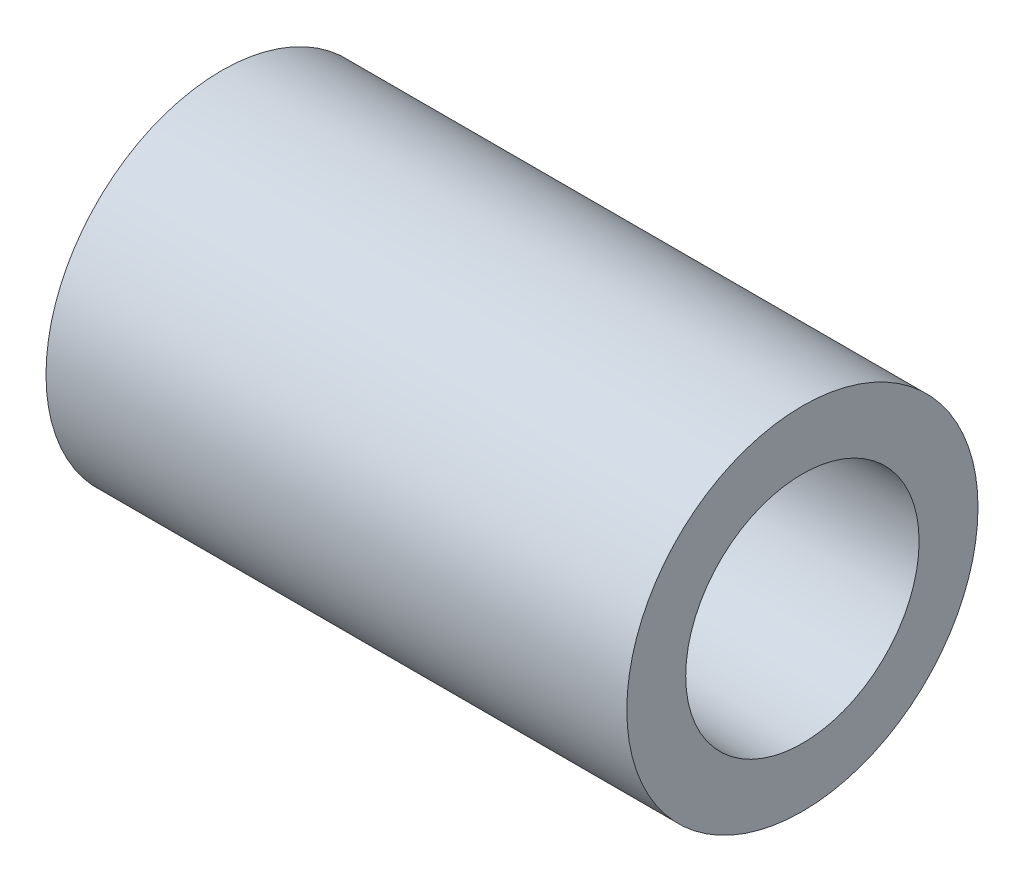
ISO-10303-21;
HEADER;
FILE_DESCRIPTION(('STEP AP214'),'2;1');
FILE_NAME('part.step','',(''),(''),'','','');
FILE_SCHEMA(('AUTOMOTIVE_DESIGN { 1 0 10303 214 1 1 1 1 }'));
ENDSEC;
DATA;
#1=APPLICATION_CONTEXT('core data for automotive mechanical design processes');
#2=APPLICATION_PROTOCOL_DEFINITION('international standard','automotive_design',2000,#1);
#3=PRODUCT_CONTEXT('',#1,'mechanical');
#4=PRODUCT('Part','Part','',(#3));
#5=PRODUCT_RELATED_PRODUCT_CATEGORY('part','',(#4));
#6=PRODUCT_DEFINITION_FORMATION('','',#4);
#7=PRODUCT_DEFINITION_CONTEXT('part definition',#1,'design');
#8=PRODUCT_DEFINITION('design','',#6,#7);
#9=PRODUCT_DEFINITION_SHAPE('','',#8);
#10=(LENGTH_UNIT() NAMED_UNIT(*) SI_UNIT(.MILLI.,.METRE.));
#11=(NAMED_UNIT(*) PLANE_ANGLE_UNIT() SI_UNIT($,.RADIAN.));
#12=(NAMED_UNIT(*) SI_UNIT($,.STERADIAN.) SOLID_ANGLE_UNIT());
#13=UNCERTAINTY_MEASURE_WITH_UNIT(LENGTH_MEASURE(1.E-05),#10,'distance_accuracy_value','');
#14=(GEOMETRIC_REPRESENTATION_CONTEXT(3) GLOBAL_UNCERTAINTY_ASSIGNED_CONTEXT((#13)) GLOBAL_UNIT_ASSIGNED_CONTEXT((#10,
#11,#12)) REPRESENTATION_CONTEXT('',''));
#15=CARTESIAN_POINT('',(0.,0.,0.));
#16=DIRECTION('',(0.,0.,1.));
#17=DIRECTION('',(1.,0.,0.));
#18=AXIS2_PLACEMENT_3D('',#15,#16,#17);
#19=CARTESIAN_POINT('',(17.065625,-10.31875,0.));
#20=DIRECTION('',(1.,0.,0.));
#21=DIRECTION('',(0.,0.,1.));
#22=AXIS2_PLACEMENT_3D('',#19,#20,#21);
#23=PLANE('',#22);
#24=CARTESIAN_POINT('',(17.065625,0.,0.));
#25=DIRECTION('',(-1.,0.,0.));
#26=DIRECTION('',(0.,0.,1.));
#27=AXIS2_PLACEMENT_3D('',#24,#25,#26);
#28=CIRCLE('',#27,10.31875);
#29=CARTESIAN_POINT('',(17.065625,0.,10.31875));
#30=VERTEX_POINT('',#29);
#31=EDGE_CURVE('E38',#30,#30,#28,.T.);
#32=ORIENTED_EDGE('',*,*,#31,.F.);
#33=EDGE_LOOP('',(#32));
#34=FACE_BOUND('',#33,.T.);
#35=CARTESIAN_POINT('',(17.065625,0.,0.));
#36=DIRECTION('',(-1.,0.,0.));
#37=DIRECTION('',(0.,0.,1.));
#38=AXIS2_PLACEMENT_3D('',#35,#36,#37);
#39=CIRCLE('',#38,6.858);
#40=CARTESIAN_POINT('',(17.065625,0.,6.858));
#41=VERTEX_POINT('',#40);
#42=EDGE_CURVE('E10',#41,#41,#39,.T.);
#43=ORIENTED_EDGE('',*,*,#42,.T.);
#44=EDGE_LOOP('',(#43));
#45=FACE_BOUND('',#44,.T.);
#46=ADVANCED_FACE('F32',(#34,#45),#23,.T.);
#47=CARTESIAN_POINT('',(1.984375,0.,0.));
#48=DIRECTION('',(1.,0.,0.));
#49=DIRECTION('',(0.,0.,1.));
#50=AXIS2_PLACEMENT_3D('',#47,#48,#49);
#51=CONICAL_SURFACE('',#50,6.38844387649436,0.0311250382690475);
#52=ORIENTED_EDGE('',*,*,#42,.F.);
#53=EDGE_LOOP('',(#52));
#54=FACE_BOUND('',#53,.T.);
#55=CARTESIAN_POINT('',(1.984375,0.,0.));
#56=DIRECTION('',(-1.,0.,0.));
#57=DIRECTION('',(0.,0.,1.));
#58=AXIS2_PLACEMENT_3D('',#55,#56,#57);
#59=CIRCLE('',#58,6.38844387649436);
#60=CARTESIAN_POINT('',(1.984375,0.,6.38844387649436));
#61=VERTEX_POINT('',#60);
#62=EDGE_CURVE('E42',#61,#61,#59,.T.);
#63=ORIENTED_EDGE('',*,*,#62,.T.);
#64=EDGE_LOOP('',(#63));
#65=FACE_BOUND('',#64,.T.);
#66=ADVANCED_FACE('F90',(#54,#65),#51,.F.);
#67=CARTESIAN_POINT('',(17.065625,0.,0.));
#68=DIRECTION('',(1.,0.,0.));
#69=DIRECTION('',(0.,0.,1.));
#70=AXIS2_PLACEMENT_3D('',#67,#68,#69);
#71=CYLINDRICAL_SURFACE('',#70,10.31875);
#72=ORIENTED_EDGE('',*,*,#31,.T.);
#73=EDGE_LOOP('',(#72));
#74=FACE_BOUND('',#73,.T.);
#75=CARTESIAN_POINT('',(-17.065625,0.,0.));
#76=DIRECTION('',(-1.,0.,0.));
#77=DIRECTION('',(0.,0.,1.));
#78=AXIS2_PLACEMENT_3D('',#75,#76,#77);
#79=CIRCLE('',#78,10.31875);
#80=CARTESIAN_POINT('',(-17.065625,0.,10.31875));
#81=VERTEX_POINT('',#80);
#82=EDGE_CURVE('E54',#81,#81,#79,.T.);
#83=ORIENTED_EDGE('',*,*,#82,.F.);
#84=EDGE_LOOP('',(#83));
#85=FACE_BOUND('',#84,.T.);
#86=ADVANCED_FACE('F95',(#74,#85),#71,.T.);
#87=CARTESIAN_POINT('',(1.984375,-10.31875,0.));
#88=DIRECTION('',(-1.,0.,0.));
#89=DIRECTION('',(0.,0.,-1.));
#90=AXIS2_PLACEMENT_3D('',#87,#88,#89);
#91=PLANE('',#90);
#92=CARTESIAN_POINT('',(1.984375,0.,0.));
#93=DIRECTION('',(-1.,0.,0.));
#94=DIRECTION('',(0.,-1.,0.));
#95=AXIS2_PLACEMENT_3D('',#92,#93,#94);
#96=CIRCLE('',#95,3.36584387649437);
#97=CARTESIAN_POINT('',(1.984375,-3.36584387649436,0.));
#98=VERTEX_POINT('',#97);
#99=EDGE_CURVE('E60',#98,#98,#96,.T.);
#100=ORIENTED_EDGE('',*,*,#99,.T.);
#101=EDGE_LOOP('',(#100));
#102=FACE_BOUND('',#101,.T.);
#103=ORIENTED_EDGE('',*,*,#62,.F.);
#104=EDGE_LOOP('',(#103));
#105=FACE_BOUND('',#104,.T.);
#106=ADVANCED_FACE('F64',(#102,#105),#91,.F.);
#107=CARTESIAN_POINT('',(-17.065625,-10.31875,0.));
#108=DIRECTION('',(-1.,0.,0.));
#109=DIRECTION('',(0.,0.,1.));
#110=AXIS2_PLACEMENT_3D('',#107,#108,#109);
#111=PLANE('',#110);
#112=ORIENTED_EDGE('',*,*,#82,.T.);
#113=EDGE_LOOP('',(#112));
#114=FACE_BOUND('',#113,.T.);
#115=CARTESIAN_POINT('',(-17.065625,0.,0.));
#116=DIRECTION('',(-1.,0.,0.));
#117=DIRECTION('',(0.,0.,1.));
#118=AXIS2_PLACEMENT_3D('',#115,#116,#117);
#119=CIRCLE('',#118,6.858);
#120=CARTESIAN_POINT('',(-17.065625,0.,6.858));
#121=VERTEX_POINT('',#120);
#122=EDGE_CURVE('E46',#121,#121,#119,.T.);
#123=ORIENTED_EDGE('',*,*,#122,.F.);
#124=EDGE_LOOP('',(#123));
#125=FACE_BOUND('',#124,.T.);
#126=ADVANCED_FACE('F81',(#114,#125),#111,.T.);
#127=CARTESIAN_POINT('',(-1.984375,0.,0.));
#128=DIRECTION('',(-1.,0.,0.));
#129=DIRECTION('',(0.,0.,1.));
#130=AXIS2_PLACEMENT_3D('',#127,#128,#129);
#131=CONICAL_SURFACE('',#130,6.38844387649436,0.0311250382690475);
#132=ORIENTED_EDGE('',*,*,#122,.T.);
#133=EDGE_LOOP('',(#132));
#134=FACE_BOUND('',#133,.T.);
#135=CARTESIAN_POINT('',(-1.984375,0.,0.));
#136=DIRECTION('',(-1.,0.,0.));
#137=DIRECTION('',(0.,0.,1.));
#138=AXIS2_PLACEMENT_3D('',#135,#136,#137);
#139=CIRCLE('',#138,6.38844387649436);
#140=CARTESIAN_POINT('',(-1.984375,0.,6.38844387649436));
#141=VERTEX_POINT('',#140);
#142=EDGE_CURVE('E51',#141,#141,#139,.T.);
#143=ORIENTED_EDGE('',*,*,#142,.F.);
#144=EDGE_LOOP('',(#143));
#145=FACE_BOUND('',#144,.T.);
#146=ADVANCED_FACE('F76',(#134,#145),#131,.F.);
#147=CARTESIAN_POINT('',(-1.984375,0.,0.));
#148=DIRECTION('',(1.,0.,0.));
#149=DIRECTION('',(0.,0.,-1.));
#150=AXIS2_PLACEMENT_3D('',#147,#148,#149);
#151=PLANE('',#150);
#152=CARTESIAN_POINT('',(-1.984375,0.,0.));
#153=DIRECTION('',(-1.,0.,0.));
#154=DIRECTION('',(0.,-1.,0.));
#155=AXIS2_PLACEMENT_3D('',#152,#153,#154);
#156=CIRCLE('',#155,3.36584387649437);
#157=CARTESIAN_POINT('',(-1.984375,-3.36584387649437,0.));
#158=VERTEX_POINT('',#157);
#159=EDGE_CURVE('E57',#158,#158,#156,.T.);
#160=ORIENTED_EDGE('',*,*,#159,.F.);
#161=EDGE_LOOP('',(#160));
#162=FACE_BOUND('',#161,.T.);
#163=ORIENTED_EDGE('',*,*,#142,.T.);
#164=EDGE_LOOP('',(#163));
#165=FACE_BOUND('',#164,.T.);
#166=ADVANCED_FACE('F70',(#162,#165),#151,.F.);
#167=CARTESIAN_POINT('',(-17.065625,0.,0.));
#168=DIRECTION('',(-1.,0.,0.));
#169=DIRECTION('',(0.,-1.,0.));
#170=AXIS2_PLACEMENT_3D('',#167,#168,#169);
#171=CYLINDRICAL_SURFACE('',#170,3.36584387649437);
#172=ORIENTED_EDGE('',*,*,#99,.F.);
#173=EDGE_LOOP('',(#172));
#174=FACE_BOUND('',#173,.T.);
#175=ORIENTED_EDGE('',*,*,#159,.T.);
#176=EDGE_LOOP('',(#175));
#177=FACE_BOUND('',#176,.T.);
#178=ADVANCED_FACE('F67',(#174,#177),#171,.F.);
#179=CLOSED_SHELL('',(#46,#66,#86,#106,#126,#146,#166,#178));
#180=MANIFOLD_SOLID_BREP('B2',#179);
#181=ADVANCED_BREP_SHAPE_REPRESENTATION('',(#18,#180),#14);
#182=SHAPE_DEFINITION_REPRESENTATION(#9,#181);
ENDSEC;
END-ISO-10303-21;
